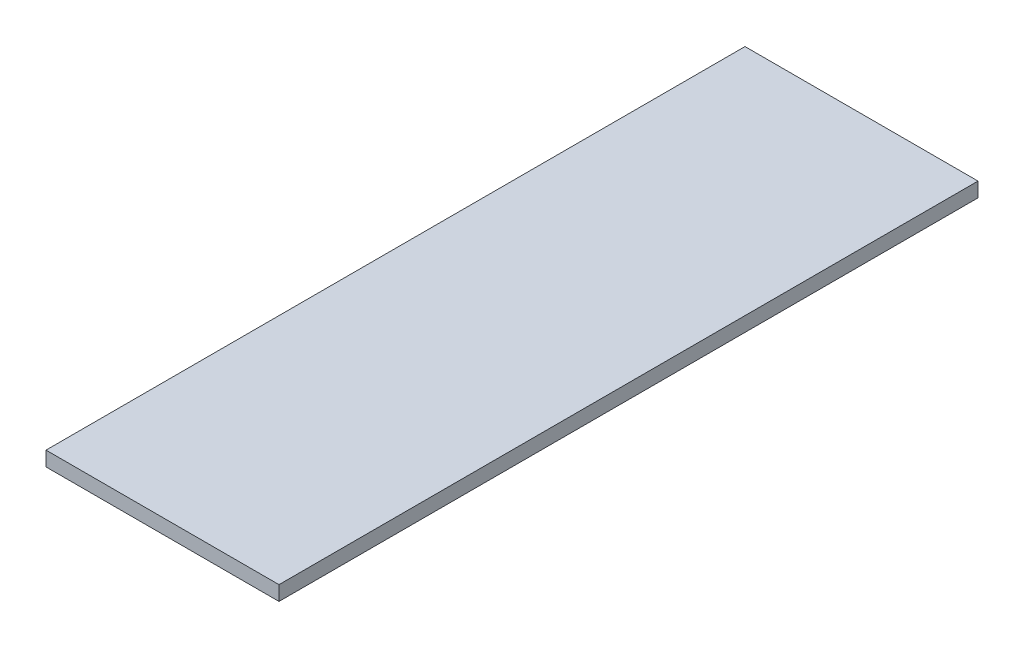
ISO-10303-21;
HEADER;
FILE_DESCRIPTION(('STEP AP214'),'2;1');
FILE_NAME('part.step','',(''),(''),'','','');
FILE_SCHEMA(('AUTOMOTIVE_DESIGN { 1 0 10303 214 1 1 1 1 }'));
ENDSEC;
DATA;
#1=APPLICATION_CONTEXT('core data for automotive mechanical design processes');
#2=APPLICATION_PROTOCOL_DEFINITION('international standard','automotive_design',2000,#1);
#3=PRODUCT_CONTEXT('',#1,'mechanical');
#4=PRODUCT('Part','Part','',(#3));
#5=PRODUCT_RELATED_PRODUCT_CATEGORY('part','',(#4));
#6=PRODUCT_DEFINITION_FORMATION('','',#4);
#7=PRODUCT_DEFINITION_CONTEXT('part definition',#1,'design');
#8=PRODUCT_DEFINITION('design','',#6,#7);
#9=PRODUCT_DEFINITION_SHAPE('','',#8);
#10=(LENGTH_UNIT() NAMED_UNIT(*) SI_UNIT(.MILLI.,.METRE.));
#11=(NAMED_UNIT(*) PLANE_ANGLE_UNIT() SI_UNIT($,.RADIAN.));
#12=(NAMED_UNIT(*) SI_UNIT($,.STERADIAN.) SOLID_ANGLE_UNIT());
#13=UNCERTAINTY_MEASURE_WITH_UNIT(LENGTH_MEASURE(1.E-05),#10,'distance_accuracy_value','');
#14=(GEOMETRIC_REPRESENTATION_CONTEXT(3) GLOBAL_UNCERTAINTY_ASSIGNED_CONTEXT((#13)) GLOBAL_UNIT_ASSIGNED_CONTEXT((#10,
#11,#12)) REPRESENTATION_CONTEXT('',''));
#15=CARTESIAN_POINT('',(0.,0.,0.));
#16=DIRECTION('',(0.,0.,1.));
#17=DIRECTION('',(1.,0.,0.));
#18=AXIS2_PLACEMENT_3D('',#15,#16,#17);
#19=CARTESIAN_POINT('',(6.35,0.79375,-19.05));
#20=DIRECTION('',(-1.,0.,0.));
#21=DIRECTION('',(0.,0.,1.));
#22=AXIS2_PLACEMENT_3D('',#19,#20,#21);
#23=PLANE('',#22);
#24=DIRECTION('',(0.,0.,-1.));
#25=VECTOR('',#24,1.);
#26=CARTESIAN_POINT('',(6.35,0.,-19.05));
#27=LINE('',#26,#25);
#28=CARTESIAN_POINT('',(6.35,0.,19.05));
#29=VERTEX_POINT('',#28);
#30=CARTESIAN_POINT('',(6.35,0.,-19.05));
#31=VERTEX_POINT('',#30);
#32=EDGE_CURVE('E101',#29,#31,#27,.T.);
#33=ORIENTED_EDGE('',*,*,#32,.T.);
#34=DIRECTION('',(0.,-1.,0.));
#35=VECTOR('',#34,1.);
#36=CARTESIAN_POINT('',(6.35,0.79375,-19.05));
#37=LINE('',#36,#35);
#38=CARTESIAN_POINT('',(6.35,0.79375,-19.05));
#39=VERTEX_POINT('',#38);
#40=EDGE_CURVE('E11',#39,#31,#37,.T.);
#41=ORIENTED_EDGE('',*,*,#40,.F.);
#42=DIRECTION('',(0.,0.,-1.));
#43=VECTOR('',#42,1.);
#44=CARTESIAN_POINT('',(6.35,0.79375,-19.05));
#45=LINE('',#44,#43);
#46=CARTESIAN_POINT('',(6.35,0.79375,19.05));
#47=VERTEX_POINT('',#46);
#48=EDGE_CURVE('E89',#47,#39,#45,.T.);
#49=ORIENTED_EDGE('',*,*,#48,.F.);
#50=DIRECTION('',(0.,-1.,0.));
#51=VECTOR('',#50,1.);
#52=CARTESIAN_POINT('',(6.35,0.79375,19.05));
#53=LINE('',#52,#51);
#54=EDGE_CURVE('E97',#47,#29,#53,.T.);
#55=ORIENTED_EDGE('',*,*,#54,.T.);
#56=EDGE_LOOP('',(#33,#41,#49,#55));
#57=FACE_BOUND('',#56,.T.);
#58=ADVANCED_FACE('F38',(#57),#23,.F.);
#59=CARTESIAN_POINT('',(-6.35,0.79375,-19.05));
#60=DIRECTION('',(0.,0.,1.));
#61=DIRECTION('',(1.,0.,0.));
#62=AXIS2_PLACEMENT_3D('',#59,#60,#61);
#63=PLANE('',#62);
#64=DIRECTION('',(-1.,0.,0.));
#65=VECTOR('',#64,1.);
#66=CARTESIAN_POINT('',(-6.35,0.,-19.05));
#67=LINE('',#66,#65);
#68=CARTESIAN_POINT('',(-6.35,0.,-19.05));
#69=VERTEX_POINT('',#68);
#70=EDGE_CURVE('E93',#31,#69,#67,.T.);
#71=ORIENTED_EDGE('',*,*,#70,.T.);
#72=DIRECTION('',(0.,-1.,0.));
#73=VECTOR('',#72,1.);
#74=CARTESIAN_POINT('',(-6.35,0.79375,-19.05));
#75=LINE('',#74,#73);
#76=CARTESIAN_POINT('',(-6.35,0.79375,-19.05));
#77=VERTEX_POINT('',#76);
#78=EDGE_CURVE('E46',#77,#69,#75,.T.);
#79=ORIENTED_EDGE('',*,*,#78,.F.);
#80=DIRECTION('',(-1.,0.,0.));
#81=VECTOR('',#80,1.);
#82=CARTESIAN_POINT('',(-6.35,0.79375,-19.05));
#83=LINE('',#82,#81);
#84=EDGE_CURVE('E84',#39,#77,#83,.T.);
#85=ORIENTED_EDGE('',*,*,#84,.F.);
#86=ORIENTED_EDGE('',*,*,#40,.T.);
#87=EDGE_LOOP('',(#71,#79,#85,#86));
#88=FACE_BOUND('',#87,.T.);
#89=ADVANCED_FACE('F92',(#88),#63,.F.);
#90=CARTESIAN_POINT('',(-6.35,0.79375,-19.05));
#91=DIRECTION('',(1.,0.,0.));
#92=DIRECTION('',(0.,0.,-1.));
#93=AXIS2_PLACEMENT_3D('',#90,#91,#92);
#94=PLANE('',#93);
#95=DIRECTION('',(0.,0.,1.));
#96=VECTOR('',#95,1.);
#97=CARTESIAN_POINT('',(-6.35,0.,-19.05));
#98=LINE('',#97,#96);
#99=CARTESIAN_POINT('',(-6.35,0.,19.05));
#100=VERTEX_POINT('',#99);
#101=EDGE_CURVE('E71',#69,#100,#98,.T.);
#102=ORIENTED_EDGE('',*,*,#101,.T.);
#103=DIRECTION('',(0.,-1.,0.));
#104=VECTOR('',#103,1.);
#105=CARTESIAN_POINT('',(-6.35,0.79375,19.05));
#106=LINE('',#105,#104);
#107=CARTESIAN_POINT('',(-6.35,0.79375,19.05));
#108=VERTEX_POINT('',#107);
#109=EDGE_CURVE('E94',#108,#100,#106,.T.);
#110=ORIENTED_EDGE('',*,*,#109,.F.);
#111=DIRECTION('',(0.,0.,1.));
#112=VECTOR('',#111,1.);
#113=CARTESIAN_POINT('',(-6.35,0.79375,-19.05));
#114=LINE('',#113,#112);
#115=EDGE_CURVE('E87',#77,#108,#114,.T.);
#116=ORIENTED_EDGE('',*,*,#115,.F.);
#117=ORIENTED_EDGE('',*,*,#78,.T.);
#118=EDGE_LOOP('',(#102,#110,#116,#117));
#119=FACE_BOUND('',#118,.T.);
#120=ADVANCED_FACE('F95',(#119),#94,.F.);
#121=CARTESIAN_POINT('',(-6.35,0.79375,19.05));
#122=DIRECTION('',(0.,0.,-1.));
#123=DIRECTION('',(-1.,0.,0.));
#124=AXIS2_PLACEMENT_3D('',#121,#122,#123);
#125=PLANE('',#124);
#126=DIRECTION('',(1.,0.,0.));
#127=VECTOR('',#126,1.);
#128=CARTESIAN_POINT('',(-6.35,0.,19.05));
#129=LINE('',#128,#127);
#130=EDGE_CURVE('E77',#100,#29,#129,.T.);
#131=ORIENTED_EDGE('',*,*,#130,.T.);
#132=ORIENTED_EDGE('',*,*,#54,.F.);
#133=DIRECTION('',(1.,0.,0.));
#134=VECTOR('',#133,1.);
#135=CARTESIAN_POINT('',(-6.35,0.79375,19.05));
#136=LINE('',#135,#134);
#137=EDGE_CURVE('E54',#108,#47,#136,.T.);
#138=ORIENTED_EDGE('',*,*,#137,.F.);
#139=ORIENTED_EDGE('',*,*,#109,.T.);
#140=EDGE_LOOP('',(#131,#132,#138,#139));
#141=FACE_BOUND('',#140,.T.);
#142=ADVANCED_FACE('F108',(#141),#125,.F.);
#143=CARTESIAN_POINT('',(0.,0.79375,0.));
#144=DIRECTION('',(0.,1.,0.));
#145=DIRECTION('',(0.,0.,1.));
#146=AXIS2_PLACEMENT_3D('',#143,#144,#145);
#147=PLANE('',#146);
#148=ORIENTED_EDGE('',*,*,#48,.T.);
#149=ORIENTED_EDGE('',*,*,#84,.T.);
#150=ORIENTED_EDGE('',*,*,#115,.T.);
#151=ORIENTED_EDGE('',*,*,#137,.T.);
#152=EDGE_LOOP('',(#148,#149,#150,#151));
#153=FACE_BOUND('',#152,.T.);
#154=ADVANCED_FACE('F85',(#153),#147,.T.);
#155=CARTESIAN_POINT('',(0.,0.,0.));
#156=DIRECTION('',(0.,1.,0.));
#157=DIRECTION('',(0.,0.,1.));
#158=AXIS2_PLACEMENT_3D('',#155,#156,#157);
#159=PLANE('',#158);
#160=ORIENTED_EDGE('',*,*,#32,.F.);
#161=ORIENTED_EDGE('',*,*,#130,.F.);
#162=ORIENTED_EDGE('',*,*,#101,.F.);
#163=ORIENTED_EDGE('',*,*,#70,.F.);
#164=EDGE_LOOP('',(#160,#161,#162,#163));
#165=FACE_BOUND('',#164,.T.);
#166=ADVANCED_FACE('F111',(#165),#159,.F.);
#167=CLOSED_SHELL('',(#58,#89,#120,#142,#154,#166));
#168=MANIFOLD_SOLID_BREP('B2',#167);
#169=ADVANCED_BREP_SHAPE_REPRESENTATION('',(#18,#168),#14);
#170=SHAPE_DEFINITION_REPRESENTATION(#9,#169);
ENDSEC;
END-ISO-10303-21;
